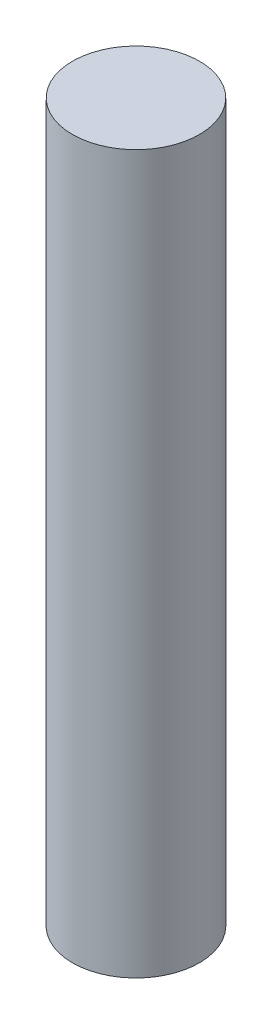
ISO-10303-21;
HEADER;
FILE_DESCRIPTION(('STEP AP214'),'2;1');
FILE_NAME('part.step','',(''),(''),'','','');
FILE_SCHEMA(('AUTOMOTIVE_DESIGN { 1 0 10303 214 1 1 1 1 }'));
ENDSEC;
DATA;
#1=APPLICATION_CONTEXT('core data for automotive mechanical design processes');
#2=APPLICATION_PROTOCOL_DEFINITION('international standard','automotive_design',2000,#1);
#3=PRODUCT_CONTEXT('',#1,'mechanical');
#4=PRODUCT('Part','Part','',(#3));
#5=PRODUCT_RELATED_PRODUCT_CATEGORY('part','',(#4));
#6=PRODUCT_DEFINITION_FORMATION('','',#4);
#7=PRODUCT_DEFINITION_CONTEXT('part definition',#1,'design');
#8=PRODUCT_DEFINITION('design','',#6,#7);
#9=PRODUCT_DEFINITION_SHAPE('','',#8);
#10=(LENGTH_UNIT() NAMED_UNIT(*) SI_UNIT(.MILLI.,.METRE.));
#11=(NAMED_UNIT(*) PLANE_ANGLE_UNIT() SI_UNIT($,.RADIAN.));
#12=(NAMED_UNIT(*) SI_UNIT($,.STERADIAN.) SOLID_ANGLE_UNIT());
#13=UNCERTAINTY_MEASURE_WITH_UNIT(LENGTH_MEASURE(1.E-05),#10,'distance_accuracy_value','');
#14=(GEOMETRIC_REPRESENTATION_CONTEXT(3) GLOBAL_UNCERTAINTY_ASSIGNED_CONTEXT((#13)) GLOBAL_UNIT_ASSIGNED_CONTEXT((#10,
#11,#12)) REPRESENTATION_CONTEXT('',''));
#15=CARTESIAN_POINT('',(0.,0.,0.));
#16=DIRECTION('',(0.,0.,1.));
#17=DIRECTION('',(1.,0.,0.));
#18=AXIS2_PLACEMENT_3D('',#15,#16,#17);
#19=CARTESIAN_POINT('',(0.,27.96,0.));
#20=DIRECTION('',(0.,-1.,0.));
#21=DIRECTION('',(0.,0.,-1.));
#22=AXIS2_PLACEMENT_3D('',#19,#20,#21);
#23=CYLINDRICAL_SURFACE('',#22,2.475);
#24=CARTESIAN_POINT('',(0.,27.96,0.));
#25=DIRECTION('',(0.,1.,0.));
#26=DIRECTION('',(0.,0.,1.));
#27=AXIS2_PLACEMENT_3D('',#24,#25,#26);
#28=CIRCLE('',#27,2.475);
#29=CARTESIAN_POINT('',(0.,27.96,2.475));
#30=VERTEX_POINT('',#29);
#31=EDGE_CURVE('E10',#30,#30,#28,.T.);
#32=ORIENTED_EDGE('',*,*,#31,.F.);
#33=EDGE_LOOP('',(#32));
#34=FACE_BOUND('',#33,.T.);
#35=CARTESIAN_POINT('',(0.,0.,0.));
#36=DIRECTION('',(0.,1.,0.));
#37=DIRECTION('',(0.,0.,1.));
#38=AXIS2_PLACEMENT_3D('',#35,#36,#37);
#39=CIRCLE('',#38,2.475);
#40=CARTESIAN_POINT('',(0.,0.,2.475));
#41=VERTEX_POINT('',#40);
#42=EDGE_CURVE('E46',#41,#41,#39,.T.);
#43=ORIENTED_EDGE('',*,*,#42,.T.);
#44=EDGE_LOOP('',(#43));
#45=FACE_BOUND('',#44,.T.);
#46=ADVANCED_FACE('F43',(#34,#45),#23,.T.);
#47=CARTESIAN_POINT('',(0.,27.96,0.));
#48=DIRECTION('',(0.,1.,0.));
#49=DIRECTION('',(0.,0.,1.));
#50=AXIS2_PLACEMENT_3D('',#47,#48,#49);
#51=PLANE('',#50);
#52=ORIENTED_EDGE('',*,*,#31,.T.);
#53=EDGE_LOOP('',(#52));
#54=FACE_BOUND('',#53,.T.);
#55=ADVANCED_FACE('F60',(#54),#51,.T.);
#56=CARTESIAN_POINT('',(0.,0.,0.));
#57=DIRECTION('',(0.,1.,0.));
#58=DIRECTION('',(0.,0.,1.));
#59=AXIS2_PLACEMENT_3D('',#56,#57,#58);
#60=PLANE('',#59);
#61=ORIENTED_EDGE('',*,*,#42,.F.);
#62=EDGE_LOOP('',(#61));
#63=FACE_BOUND('',#62,.T.);
#64=ADVANCED_FACE('F58',(#63),#60,.F.);
#65=CLOSED_SHELL('',(#46,#55,#64));
#66=MANIFOLD_SOLID_BREP('B2',#65);
#67=ADVANCED_BREP_SHAPE_REPRESENTATION('',(#18,#66),#14);
#68=SHAPE_DEFINITION_REPRESENTATION(#9,#67);
ENDSEC;
END-ISO-10303-21;
